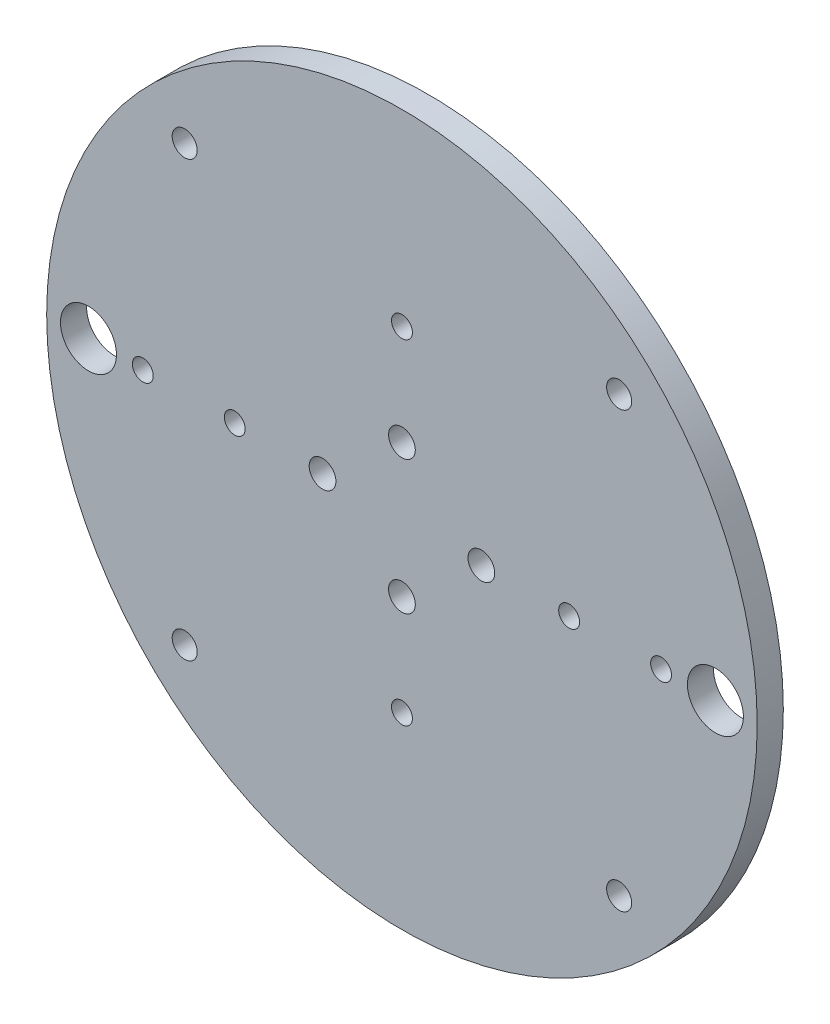
ISO-10303-21;
HEADER;
FILE_DESCRIPTION(('STEP AP214'),'2;1');
FILE_NAME('part.step','',(''),(''),'','','');
FILE_SCHEMA(('AUTOMOTIVE_DESIGN { 1 0 10303 214 1 1 1 1 }'));
ENDSEC;
DATA;
#1=APPLICATION_CONTEXT('core data for automotive mechanical design processes');
#2=APPLICATION_PROTOCOL_DEFINITION('international standard','automotive_design',2000,#1);
#3=PRODUCT_CONTEXT('',#1,'mechanical');
#4=PRODUCT('Part','Part','',(#3));
#5=PRODUCT_RELATED_PRODUCT_CATEGORY('part','',(#4));
#6=PRODUCT_DEFINITION_FORMATION('','',#4);
#7=PRODUCT_DEFINITION_CONTEXT('part definition',#1,'design');
#8=PRODUCT_DEFINITION('design','',#6,#7);
#9=PRODUCT_DEFINITION_SHAPE('','',#8);
#10=(LENGTH_UNIT() NAMED_UNIT(*) SI_UNIT(.MILLI.,.METRE.));
#11=(NAMED_UNIT(*) PLANE_ANGLE_UNIT() SI_UNIT($,.RADIAN.));
#12=(NAMED_UNIT(*) SI_UNIT($,.STERADIAN.) SOLID_ANGLE_UNIT());
#13=UNCERTAINTY_MEASURE_WITH_UNIT(LENGTH_MEASURE(1.E-05),#10,'distance_accuracy_value','');
#14=(GEOMETRIC_REPRESENTATION_CONTEXT(3) GLOBAL_UNCERTAINTY_ASSIGNED_CONTEXT((#13)) GLOBAL_UNIT_ASSIGNED_CONTEXT((#10,
#11,#12)) REPRESENTATION_CONTEXT('',''));
#15=CARTESIAN_POINT('',(0.,0.,0.));
#16=DIRECTION('',(0.,0.,1.));
#17=DIRECTION('',(1.,0.,0.));
#18=AXIS2_PLACEMENT_3D('',#15,#16,#17);
#19=CARTESIAN_POINT('',(0.,0.,3.125));
#20=DIRECTION('',(0.,0.,-1.));
#21=DIRECTION('',(-1.,0.,0.));
#22=AXIS2_PLACEMENT_3D('',#19,#20,#21);
#23=CYLINDRICAL_SURFACE('',#22,42.5);
#24=CARTESIAN_POINT('',(0.,0.,3.125));
#25=DIRECTION('',(0.,0.,1.));
#26=DIRECTION('',(1.,0.,0.));
#27=AXIS2_PLACEMENT_3D('',#24,#25,#26);
#28=CIRCLE('',#27,42.5);
#29=CARTESIAN_POINT('',(42.5,0.,3.125));
#30=VERTEX_POINT('',#29);
#31=EDGE_CURVE('E10',#30,#30,#28,.T.);
#32=ORIENTED_EDGE('',*,*,#31,.F.);
#33=EDGE_LOOP('',(#32));
#34=FACE_BOUND('',#33,.T.);
#35=CARTESIAN_POINT('',(0.,0.,0.));
#36=DIRECTION('',(0.,0.,1.));
#37=DIRECTION('',(1.,0.,0.));
#38=AXIS2_PLACEMENT_3D('',#35,#36,#37);
#39=CIRCLE('',#38,42.5);
#40=CARTESIAN_POINT('',(42.5,0.,0.));
#41=VERTEX_POINT('',#40);
#42=EDGE_CURVE('E40',#41,#41,#39,.T.);
#43=ORIENTED_EDGE('',*,*,#42,.T.);
#44=EDGE_LOOP('',(#43));
#45=FACE_BOUND('',#44,.T.);
#46=ADVANCED_FACE('F37',(#34,#45),#23,.T.);
#47=CARTESIAN_POINT('',(0.,0.,3.125));
#48=DIRECTION('',(0.,0.,1.));
#49=DIRECTION('',(1.,0.,0.));
#50=AXIS2_PLACEMENT_3D('',#47,#48,#49);
#51=PLANE('',#50);
#52=CARTESIAN_POINT('',(-37.4999999999997,1.84410575373168E-13,3.125));
#53=DIRECTION('',(0.,0.,-1.));
#54=DIRECTION('',(-1.,0.,0.));
#55=AXIS2_PLACEMENT_3D('',#52,#53,#54);
#56=CIRCLE('',#55,3.35000000000024);
#57=CARTESIAN_POINT('',(-40.85,1.84410575373168E-13,3.125));
#58=VERTEX_POINT('',#57);
#59=EDGE_CURVE('E101',#58,#58,#56,.T.);
#60=ORIENTED_EDGE('',*,*,#59,.T.);
#61=EDGE_LOOP('',(#60));
#62=FACE_BOUND('',#61,.T.);
#63=CARTESIAN_POINT('',(37.5000000000003,1.9153491814533E-13,3.125));
#64=DIRECTION('',(0.,0.,-1.));
#65=DIRECTION('',(-1.,0.,0.));
#66=AXIS2_PLACEMENT_3D('',#63,#64,#65);
#67=CIRCLE('',#66,3.35000000000026);
#68=CARTESIAN_POINT('',(34.15,1.9153491814533E-13,3.125));
#69=VERTEX_POINT('',#68);
#70=EDGE_CURVE('E133',#69,#69,#67,.T.);
#71=ORIENTED_EDGE('',*,*,#70,.T.);
#72=EDGE_LOOP('',(#71));
#73=FACE_BOUND('',#72,.T.);
#74=CARTESIAN_POINT('',(31.0000000000003,1.9153491814533E-13,3.125));
#75=DIRECTION('',(0.,0.,-1.));
#76=DIRECTION('',(-1.,0.,0.));
#77=AXIS2_PLACEMENT_3D('',#74,#75,#76);
#78=CIRCLE('',#77,1.25000000000026);
#79=CARTESIAN_POINT('',(29.75,1.9153491814533E-13,3.125));
#80=VERTEX_POINT('',#79);
#81=EDGE_CURVE('E127',#80,#80,#78,.T.);
#82=ORIENTED_EDGE('',*,*,#81,.T.);
#83=EDGE_LOOP('',(#82));
#84=FACE_BOUND('',#83,.T.);
#85=CARTESIAN_POINT('',(-30.9999999999997,1.84500780993918E-13,3.125));
#86=DIRECTION('',(0.,0.,-1.));
#87=DIRECTION('',(-1.,0.,0.));
#88=AXIS2_PLACEMENT_3D('',#85,#86,#87);
#89=CIRCLE('',#88,1.25000000000024);
#90=CARTESIAN_POINT('',(-32.25,1.84500780993918E-13,3.125));
#91=VERTEX_POINT('',#90);
#92=EDGE_CURVE('E121',#91,#91,#89,.T.);
#93=ORIENTED_EDGE('',*,*,#92,.T.);
#94=EDGE_LOOP('',(#93));
#95=FACE_BOUND('',#94,.T.);
#96=CARTESIAN_POINT('',(-9.5,0.,3.125));
#97=DIRECTION('',(0.,0.,1.));
#98=DIRECTION('',(1.,0.,0.));
#99=AXIS2_PLACEMENT_3D('',#96,#97,#98);
#100=CIRCLE('',#99,1.6);
#101=CARTESIAN_POINT('',(-7.9,0.,3.125));
#102=VERTEX_POINT('',#101);
#103=EDGE_CURVE('E116',#102,#102,#100,.T.);
#104=ORIENTED_EDGE('',*,*,#103,.F.);
#105=EDGE_LOOP('',(#104));
#106=FACE_BOUND('',#105,.T.);
#107=CARTESIAN_POINT('',(0.,8.,3.125));
#108=DIRECTION('',(0.,0.,1.));
#109=DIRECTION('',(1.,0.,0.));
#110=AXIS2_PLACEMENT_3D('',#107,#108,#109);
#111=CIRCLE('',#110,1.6);
#112=CARTESIAN_POINT('',(1.6,8.,3.125));
#113=VERTEX_POINT('',#112);
#114=EDGE_CURVE('E113',#113,#113,#111,.T.);
#115=ORIENTED_EDGE('',*,*,#114,.F.);
#116=EDGE_LOOP('',(#115));
#117=FACE_BOUND('',#116,.T.);
#118=CARTESIAN_POINT('',(9.5,0.,3.125));
#119=DIRECTION('',(0.,0.,1.));
#120=DIRECTION('',(1.,0.,0.));
#121=AXIS2_PLACEMENT_3D('',#118,#119,#120);
#122=CIRCLE('',#121,1.6);
#123=CARTESIAN_POINT('',(11.1,0.,3.125));
#124=VERTEX_POINT('',#123);
#125=EDGE_CURVE('E107',#124,#124,#122,.T.);
#126=ORIENTED_EDGE('',*,*,#125,.F.);
#127=EDGE_LOOP('',(#126));
#128=FACE_BOUND('',#127,.T.);
#129=CARTESIAN_POINT('',(0.,-8.00000000000001,3.125));
#130=DIRECTION('',(0.,0.,1.));
#131=DIRECTION('',(1.,0.,0.));
#132=AXIS2_PLACEMENT_3D('',#129,#130,#131);
#133=CIRCLE('',#132,1.6);
#134=CARTESIAN_POINT('',(1.6,-8.00000000000001,3.125));
#135=VERTEX_POINT('',#134);
#136=EDGE_CURVE('E100',#135,#135,#133,.T.);
#137=ORIENTED_EDGE('',*,*,#136,.F.);
#138=EDGE_LOOP('',(#137));
#139=FACE_BOUND('',#138,.T.);
#140=CARTESIAN_POINT('',(0.,20.,3.125));
#141=DIRECTION('',(0.,0.,1.));
#142=DIRECTION('',(1.,0.,0.));
#143=AXIS2_PLACEMENT_3D('',#140,#141,#142);
#144=CIRCLE('',#143,1.25);
#145=CARTESIAN_POINT('',(1.25,20.,3.125));
#146=VERTEX_POINT('',#145);
#147=EDGE_CURVE('E92',#146,#146,#144,.T.);
#148=ORIENTED_EDGE('',*,*,#147,.F.);
#149=EDGE_LOOP('',(#148));
#150=FACE_BOUND('',#149,.T.);
#151=CARTESIAN_POINT('',(20.,0.,3.125));
#152=DIRECTION('',(0.,0.,1.));
#153=DIRECTION('',(1.,0.,0.));
#154=AXIS2_PLACEMENT_3D('',#151,#152,#153);
#155=CIRCLE('',#154,1.25);
#156=CARTESIAN_POINT('',(21.25,0.,3.125));
#157=VERTEX_POINT('',#156);
#158=EDGE_CURVE('E89',#157,#157,#155,.T.);
#159=ORIENTED_EDGE('',*,*,#158,.F.);
#160=EDGE_LOOP('',(#159));
#161=FACE_BOUND('',#160,.T.);
#162=CARTESIAN_POINT('',(0.,-20.,3.125));
#163=DIRECTION('',(0.,0.,1.));
#164=DIRECTION('',(1.,0.,0.));
#165=AXIS2_PLACEMENT_3D('',#162,#163,#164);
#166=CIRCLE('',#165,1.25);
#167=CARTESIAN_POINT('',(1.25,-20.,3.125));
#168=VERTEX_POINT('',#167);
#169=EDGE_CURVE('E83',#168,#168,#166,.T.);
#170=ORIENTED_EDGE('',*,*,#169,.F.);
#171=EDGE_LOOP('',(#170));
#172=FACE_BOUND('',#171,.T.);
#173=CARTESIAN_POINT('',(-20.,0.,3.125));
#174=DIRECTION('',(0.,0.,1.));
#175=DIRECTION('',(1.,0.,0.));
#176=AXIS2_PLACEMENT_3D('',#173,#174,#175);
#177=CIRCLE('',#176,1.25);
#178=CARTESIAN_POINT('',(-18.75,0.,3.125));
#179=VERTEX_POINT('',#178);
#180=EDGE_CURVE('E76',#179,#179,#177,.T.);
#181=ORIENTED_EDGE('',*,*,#180,.F.);
#182=EDGE_LOOP('',(#181));
#183=FACE_BOUND('',#182,.T.);
#184=CARTESIAN_POINT('',(25.9861742086056,-25.9861742086057,3.125));
#185=DIRECTION('',(0.,0.,-1.));
#186=DIRECTION('',(-1.,0.,0.));
#187=AXIS2_PLACEMENT_3D('',#184,#185,#186);
#188=CIRCLE('',#187,1.5);
#189=CARTESIAN_POINT('',(24.4861742086056,-25.9861742086057,3.125));
#190=VERTEX_POINT('',#189);
#191=EDGE_CURVE('E62',#190,#190,#188,.T.);
#192=ORIENTED_EDGE('',*,*,#191,.T.);
#193=EDGE_LOOP('',(#192));
#194=FACE_BOUND('',#193,.T.);
#195=CARTESIAN_POINT('',(-25.9861742086055,25.9861742086057,3.125));
#196=DIRECTION('',(0.,0.,-1.));
#197=DIRECTION('',(-1.,0.,0.));
#198=AXIS2_PLACEMENT_3D('',#195,#196,#197);
#199=CIRCLE('',#198,1.5);
#200=CARTESIAN_POINT('',(-27.4861742086055,25.9861742086057,3.125));
#201=VERTEX_POINT('',#200);
#202=EDGE_CURVE('E55',#201,#201,#199,.T.);
#203=ORIENTED_EDGE('',*,*,#202,.T.);
#204=EDGE_LOOP('',(#203));
#205=FACE_BOUND('',#204,.T.);
#206=CARTESIAN_POINT('',(25.9861742086057,25.9861742086056,3.125));
#207=DIRECTION('',(0.,0.,-1.));
#208=DIRECTION('',(-1.,0.,0.));
#209=AXIS2_PLACEMENT_3D('',#206,#207,#208);
#210=CIRCLE('',#209,1.5);
#211=CARTESIAN_POINT('',(24.4861742086057,25.9861742086056,3.125));
#212=VERTEX_POINT('',#211);
#213=EDGE_CURVE('E67',#212,#212,#210,.T.);
#214=ORIENTED_EDGE('',*,*,#213,.T.);
#215=EDGE_LOOP('',(#214));
#216=FACE_BOUND('',#215,.T.);
#217=CARTESIAN_POINT('',(-25.9861742086056,-25.9861742086056,3.125));
#218=DIRECTION('',(0.,0.,-1.));
#219=DIRECTION('',(-1.,0.,0.));
#220=AXIS2_PLACEMENT_3D('',#217,#218,#219);
#221=CIRCLE('',#220,1.5);
#222=CARTESIAN_POINT('',(-27.4861742086056,-25.9861742086056,3.125));
#223=VERTEX_POINT('',#222);
#224=EDGE_CURVE('E47',#223,#223,#221,.T.);
#225=ORIENTED_EDGE('',*,*,#224,.T.);
#226=EDGE_LOOP('',(#225));
#227=FACE_BOUND('',#226,.T.);
#228=ORIENTED_EDGE('',*,*,#31,.T.);
#229=EDGE_LOOP('',(#228));
#230=FACE_BOUND('',#229,.T.);
#231=ADVANCED_FACE('F145',(#62,#73,#84,#95,#106,#117,#128,#139,#150,#161,#172,#183,#194,#205,
#216,#227,#230),#51,.T.);
#232=CARTESIAN_POINT('',(0.,0.,0.));
#233=DIRECTION('',(0.,0.,1.));
#234=DIRECTION('',(1.,0.,0.));
#235=AXIS2_PLACEMENT_3D('',#232,#233,#234);
#236=PLANE('',#235);
#237=CARTESIAN_POINT('',(-37.4999999999997,1.84410575373168E-13,0.));
#238=DIRECTION('',(0.,0.,-1.));
#239=DIRECTION('',(-1.,0.,0.));
#240=AXIS2_PLACEMENT_3D('',#237,#238,#239);
#241=CIRCLE('',#240,3.35000000000024);
#242=CARTESIAN_POINT('',(-40.85,1.84410575373168E-13,0.));
#243=VERTEX_POINT('',#242);
#244=EDGE_CURVE('E139',#243,#243,#241,.T.);
#245=ORIENTED_EDGE('',*,*,#244,.F.);
#246=EDGE_LOOP('',(#245));
#247=FACE_BOUND('',#246,.T.);
#248=CARTESIAN_POINT('',(37.5000000000003,1.9153491814533E-13,0.));
#249=DIRECTION('',(0.,0.,-1.));
#250=DIRECTION('',(-1.,0.,0.));
#251=AXIS2_PLACEMENT_3D('',#248,#249,#250);
#252=CIRCLE('',#251,3.35000000000026);
#253=CARTESIAN_POINT('',(34.15,1.9153491814533E-13,0.));
#254=VERTEX_POINT('',#253);
#255=EDGE_CURVE('E136',#254,#254,#252,.T.);
#256=ORIENTED_EDGE('',*,*,#255,.F.);
#257=EDGE_LOOP('',(#256));
#258=FACE_BOUND('',#257,.T.);
#259=CARTESIAN_POINT('',(31.0000000000003,1.9153491814533E-13,0.));
#260=DIRECTION('',(0.,0.,-1.));
#261=DIRECTION('',(-1.,0.,0.));
#262=AXIS2_PLACEMENT_3D('',#259,#260,#261);
#263=CIRCLE('',#262,1.25000000000026);
#264=CARTESIAN_POINT('',(29.75,1.9153491814533E-13,0.));
#265=VERTEX_POINT('',#264);
#266=EDGE_CURVE('E130',#265,#265,#263,.T.);
#267=ORIENTED_EDGE('',*,*,#266,.F.);
#268=EDGE_LOOP('',(#267));
#269=FACE_BOUND('',#268,.T.);
#270=CARTESIAN_POINT('',(-30.9999999999997,1.84500780993918E-13,0.));
#271=DIRECTION('',(0.,0.,-1.));
#272=DIRECTION('',(-1.,0.,0.));
#273=AXIS2_PLACEMENT_3D('',#270,#271,#272);
#274=CIRCLE('',#273,1.25000000000024);
#275=CARTESIAN_POINT('',(-32.25,1.84500780993918E-13,0.));
#276=VERTEX_POINT('',#275);
#277=EDGE_CURVE('E124',#276,#276,#274,.T.);
#278=ORIENTED_EDGE('',*,*,#277,.F.);
#279=EDGE_LOOP('',(#278));
#280=FACE_BOUND('',#279,.T.);
#281=CARTESIAN_POINT('',(-9.5,0.,0.));
#282=DIRECTION('',(0.,0.,1.));
#283=DIRECTION('',(1.,0.,0.));
#284=AXIS2_PLACEMENT_3D('',#281,#282,#283);
#285=CIRCLE('',#284,1.6);
#286=CARTESIAN_POINT('',(-7.9,0.,0.));
#287=VERTEX_POINT('',#286);
#288=EDGE_CURVE('E77',#287,#287,#285,.T.);
#289=ORIENTED_EDGE('',*,*,#288,.T.);
#290=EDGE_LOOP('',(#289));
#291=FACE_BOUND('',#290,.T.);
#292=CARTESIAN_POINT('',(0.,8.,0.));
#293=DIRECTION('',(0.,0.,1.));
#294=DIRECTION('',(1.,0.,0.));
#295=AXIS2_PLACEMENT_3D('',#292,#293,#294);
#296=CIRCLE('',#295,1.6);
#297=CARTESIAN_POINT('',(1.6,8.,0.));
#298=VERTEX_POINT('',#297);
#299=EDGE_CURVE('E110',#298,#298,#296,.T.);
#300=ORIENTED_EDGE('',*,*,#299,.T.);
#301=EDGE_LOOP('',(#300));
#302=FACE_BOUND('',#301,.T.);
#303=CARTESIAN_POINT('',(9.5,0.,0.));
#304=DIRECTION('',(0.,0.,1.));
#305=DIRECTION('',(1.,0.,0.));
#306=AXIS2_PLACEMENT_3D('',#303,#304,#305);
#307=CIRCLE('',#306,1.6);
#308=CARTESIAN_POINT('',(11.1,0.,0.));
#309=VERTEX_POINT('',#308);
#310=EDGE_CURVE('E104',#309,#309,#307,.T.);
#311=ORIENTED_EDGE('',*,*,#310,.T.);
#312=EDGE_LOOP('',(#311));
#313=FACE_BOUND('',#312,.T.);
#314=CARTESIAN_POINT('',(0.,-8.00000000000001,0.));
#315=DIRECTION('',(0.,0.,1.));
#316=DIRECTION('',(1.,0.,0.));
#317=AXIS2_PLACEMENT_3D('',#314,#315,#316);
#318=CIRCLE('',#317,1.6);
#319=CARTESIAN_POINT('',(1.6,-8.00000000000001,0.));
#320=VERTEX_POINT('',#319);
#321=EDGE_CURVE('E97',#320,#320,#318,.T.);
#322=ORIENTED_EDGE('',*,*,#321,.T.);
#323=EDGE_LOOP('',(#322));
#324=FACE_BOUND('',#323,.T.);
#325=CARTESIAN_POINT('',(0.,20.,0.));
#326=DIRECTION('',(0.,0.,1.));
#327=DIRECTION('',(1.,0.,0.));
#328=AXIS2_PLACEMENT_3D('',#325,#326,#327);
#329=CIRCLE('',#328,1.25);
#330=CARTESIAN_POINT('',(1.25,20.,0.));
#331=VERTEX_POINT('',#330);
#332=EDGE_CURVE('E70',#331,#331,#329,.T.);
#333=ORIENTED_EDGE('',*,*,#332,.T.);
#334=EDGE_LOOP('',(#333));
#335=FACE_BOUND('',#334,.T.);
#336=CARTESIAN_POINT('',(20.,0.,0.));
#337=DIRECTION('',(0.,0.,1.));
#338=DIRECTION('',(1.,0.,0.));
#339=AXIS2_PLACEMENT_3D('',#336,#337,#338);
#340=CIRCLE('',#339,1.25);
#341=CARTESIAN_POINT('',(21.25,0.,0.));
#342=VERTEX_POINT('',#341);
#343=EDGE_CURVE('E86',#342,#342,#340,.T.);
#344=ORIENTED_EDGE('',*,*,#343,.T.);
#345=EDGE_LOOP('',(#344));
#346=FACE_BOUND('',#345,.T.);
#347=CARTESIAN_POINT('',(0.,-20.,0.));
#348=DIRECTION('',(0.,0.,1.));
#349=DIRECTION('',(1.,0.,0.));
#350=AXIS2_PLACEMENT_3D('',#347,#348,#349);
#351=CIRCLE('',#350,1.25);
#352=CARTESIAN_POINT('',(1.25,-20.,0.));
#353=VERTEX_POINT('',#352);
#354=EDGE_CURVE('E80',#353,#353,#351,.T.);
#355=ORIENTED_EDGE('',*,*,#354,.T.);
#356=EDGE_LOOP('',(#355));
#357=FACE_BOUND('',#356,.T.);
#358=CARTESIAN_POINT('',(-20.,0.,0.));
#359=DIRECTION('',(0.,0.,1.));
#360=DIRECTION('',(1.,0.,0.));
#361=AXIS2_PLACEMENT_3D('',#358,#359,#360);
#362=CIRCLE('',#361,1.25);
#363=CARTESIAN_POINT('',(-18.75,0.,0.));
#364=VERTEX_POINT('',#363);
#365=EDGE_CURVE('E73',#364,#364,#362,.T.);
#366=ORIENTED_EDGE('',*,*,#365,.T.);
#367=EDGE_LOOP('',(#366));
#368=FACE_BOUND('',#367,.T.);
#369=CARTESIAN_POINT('',(25.9861742086056,-25.9861742086057,0.));
#370=DIRECTION('',(0.,0.,-1.));
#371=DIRECTION('',(-1.,0.,0.));
#372=AXIS2_PLACEMENT_3D('',#369,#370,#371);
#373=CIRCLE('',#372,1.5);
#374=CARTESIAN_POINT('',(24.4861742086056,-25.9861742086057,0.));
#375=VERTEX_POINT('',#374);
#376=EDGE_CURVE('E52',#375,#375,#373,.T.);
#377=ORIENTED_EDGE('',*,*,#376,.F.);
#378=EDGE_LOOP('',(#377));
#379=FACE_BOUND('',#378,.T.);
#380=CARTESIAN_POINT('',(-25.9861742086055,25.9861742086057,0.));
#381=DIRECTION('',(0.,0.,-1.));
#382=DIRECTION('',(-1.,0.,0.));
#383=AXIS2_PLACEMENT_3D('',#380,#381,#382);
#384=CIRCLE('',#383,1.5);
#385=CARTESIAN_POINT('',(-27.4861742086055,25.9861742086057,0.));
#386=VERTEX_POINT('',#385);
#387=EDGE_CURVE('E58',#386,#386,#384,.T.);
#388=ORIENTED_EDGE('',*,*,#387,.F.);
#389=EDGE_LOOP('',(#388));
#390=FACE_BOUND('',#389,.T.);
#391=CARTESIAN_POINT('',(25.9861742086057,25.9861742086056,0.));
#392=DIRECTION('',(0.,0.,-1.));
#393=DIRECTION('',(-1.,0.,0.));
#394=AXIS2_PLACEMENT_3D('',#391,#392,#393);
#395=CIRCLE('',#394,1.5);
#396=CARTESIAN_POINT('',(24.4861742086057,25.9861742086056,0.));
#397=VERTEX_POINT('',#396);
#398=EDGE_CURVE('E59',#397,#397,#395,.T.);
#399=ORIENTED_EDGE('',*,*,#398,.F.);
#400=EDGE_LOOP('',(#399));
#401=FACE_BOUND('',#400,.T.);
#402=CARTESIAN_POINT('',(-25.9861742086056,-25.9861742086056,0.));
#403=DIRECTION('',(0.,0.,-1.));
#404=DIRECTION('',(-1.,0.,0.));
#405=AXIS2_PLACEMENT_3D('',#402,#403,#404);
#406=CIRCLE('',#405,1.5);
#407=CARTESIAN_POINT('',(-27.4861742086056,-25.9861742086056,0.));
#408=VERTEX_POINT('',#407);
#409=EDGE_CURVE('E49',#408,#408,#406,.T.);
#410=ORIENTED_EDGE('',*,*,#409,.F.);
#411=EDGE_LOOP('',(#410));
#412=FACE_BOUND('',#411,.T.);
#413=ORIENTED_EDGE('',*,*,#42,.F.);
#414=EDGE_LOOP('',(#413));
#415=FACE_BOUND('',#414,.T.);
#416=ADVANCED_FACE('F155',(#247,#258,#269,#280,#291,#302,#313,#324,#335,#346,#357,#368,#379,
#390,#401,#412,#415),#236,.F.);
#417=CARTESIAN_POINT('',(-25.9861742086056,-25.9861742086056,3.125));
#418=DIRECTION('',(0.,0.,-1.));
#419=DIRECTION('',(-1.,0.,0.));
#420=AXIS2_PLACEMENT_3D('',#417,#418,#419);
#421=CYLINDRICAL_SURFACE('',#420,1.5);
#422=ORIENTED_EDGE('',*,*,#224,.F.);
#423=EDGE_LOOP('',(#422));
#424=FACE_BOUND('',#423,.T.);
#425=ORIENTED_EDGE('',*,*,#409,.T.);
#426=EDGE_LOOP('',(#425));
#427=FACE_BOUND('',#426,.T.);
#428=ADVANCED_FACE('F158',(#424,#427),#421,.F.);
#429=CARTESIAN_POINT('',(25.9861742086057,25.9861742086056,3.125));
#430=DIRECTION('',(0.,0.,-1.));
#431=DIRECTION('',(-1.,0.,0.));
#432=AXIS2_PLACEMENT_3D('',#429,#430,#431);
#433=CYLINDRICAL_SURFACE('',#432,1.5);
#434=ORIENTED_EDGE('',*,*,#213,.F.);
#435=EDGE_LOOP('',(#434));
#436=FACE_BOUND('',#435,.T.);
#437=ORIENTED_EDGE('',*,*,#398,.T.);
#438=EDGE_LOOP('',(#437));
#439=FACE_BOUND('',#438,.T.);
#440=ADVANCED_FACE('F203',(#436,#439),#433,.F.);
#441=CARTESIAN_POINT('',(-25.9861742086055,25.9861742086057,3.125));
#442=DIRECTION('',(0.,0.,-1.));
#443=DIRECTION('',(-1.,0.,0.));
#444=AXIS2_PLACEMENT_3D('',#441,#442,#443);
#445=CYLINDRICAL_SURFACE('',#444,1.5);
#446=ORIENTED_EDGE('',*,*,#202,.F.);
#447=EDGE_LOOP('',(#446));
#448=FACE_BOUND('',#447,.T.);
#449=ORIENTED_EDGE('',*,*,#387,.T.);
#450=EDGE_LOOP('',(#449));
#451=FACE_BOUND('',#450,.T.);
#452=ADVANCED_FACE('F205',(#448,#451),#445,.F.);
#453=CARTESIAN_POINT('',(25.9861742086056,-25.9861742086057,3.125));
#454=DIRECTION('',(0.,0.,-1.));
#455=DIRECTION('',(-1.,0.,0.));
#456=AXIS2_PLACEMENT_3D('',#453,#454,#455);
#457=CYLINDRICAL_SURFACE('',#456,1.5);
#458=ORIENTED_EDGE('',*,*,#191,.F.);
#459=EDGE_LOOP('',(#458));
#460=FACE_BOUND('',#459,.T.);
#461=ORIENTED_EDGE('',*,*,#376,.T.);
#462=EDGE_LOOP('',(#461));
#463=FACE_BOUND('',#462,.T.);
#464=ADVANCED_FACE('F208',(#460,#463),#457,.F.);
#465=CARTESIAN_POINT('',(-20.,0.,0.));
#466=DIRECTION('',(0.,0.,1.));
#467=DIRECTION('',(1.,0.,0.));
#468=AXIS2_PLACEMENT_3D('',#465,#466,#467);
#469=CYLINDRICAL_SURFACE('',#468,1.25);
#470=ORIENTED_EDGE('',*,*,#365,.F.);
#471=EDGE_LOOP('',(#470));
#472=FACE_BOUND('',#471,.T.);
#473=ORIENTED_EDGE('',*,*,#180,.T.);
#474=EDGE_LOOP('',(#473));
#475=FACE_BOUND('',#474,.T.);
#476=ADVANCED_FACE('F212',(#472,#475),#469,.F.);
#477=CARTESIAN_POINT('',(0.,-20.,0.));
#478=DIRECTION('',(0.,0.,1.));
#479=DIRECTION('',(1.,0.,0.));
#480=AXIS2_PLACEMENT_3D('',#477,#478,#479);
#481=CYLINDRICAL_SURFACE('',#480,1.25);
#482=ORIENTED_EDGE('',*,*,#354,.F.);
#483=EDGE_LOOP('',(#482));
#484=FACE_BOUND('',#483,.T.);
#485=ORIENTED_EDGE('',*,*,#169,.T.);
#486=EDGE_LOOP('',(#485));
#487=FACE_BOUND('',#486,.T.);
#488=ADVANCED_FACE('F219',(#484,#487),#481,.F.);
#489=CARTESIAN_POINT('',(20.,0.,0.));
#490=DIRECTION('',(0.,0.,1.));
#491=DIRECTION('',(1.,0.,0.));
#492=AXIS2_PLACEMENT_3D('',#489,#490,#491);
#493=CYLINDRICAL_SURFACE('',#492,1.25);
#494=ORIENTED_EDGE('',*,*,#343,.F.);
#495=EDGE_LOOP('',(#494));
#496=FACE_BOUND('',#495,.T.);
#497=ORIENTED_EDGE('',*,*,#158,.T.);
#498=EDGE_LOOP('',(#497));
#499=FACE_BOUND('',#498,.T.);
#500=ADVANCED_FACE('F223',(#496,#499),#493,.F.);
#501=CARTESIAN_POINT('',(0.,20.,0.));
#502=DIRECTION('',(0.,0.,1.));
#503=DIRECTION('',(1.,0.,0.));
#504=AXIS2_PLACEMENT_3D('',#501,#502,#503);
#505=CYLINDRICAL_SURFACE('',#504,1.25);
#506=ORIENTED_EDGE('',*,*,#332,.F.);
#507=EDGE_LOOP('',(#506));
#508=FACE_BOUND('',#507,.T.);
#509=ORIENTED_EDGE('',*,*,#147,.T.);
#510=EDGE_LOOP('',(#509));
#511=FACE_BOUND('',#510,.T.);
#512=ADVANCED_FACE('F227',(#508,#511),#505,.F.);
#513=CARTESIAN_POINT('',(0.,-8.00000000000001,0.));
#514=DIRECTION('',(0.,0.,1.));
#515=DIRECTION('',(1.,0.,0.));
#516=AXIS2_PLACEMENT_3D('',#513,#514,#515);
#517=CYLINDRICAL_SURFACE('',#516,1.6);
#518=ORIENTED_EDGE('',*,*,#321,.F.);
#519=EDGE_LOOP('',(#518));
#520=FACE_BOUND('',#519,.T.);
#521=ORIENTED_EDGE('',*,*,#136,.T.);
#522=EDGE_LOOP('',(#521));
#523=FACE_BOUND('',#522,.T.);
#524=ADVANCED_FACE('F231',(#520,#523),#517,.F.);
#525=CARTESIAN_POINT('',(9.5,0.,0.));
#526=DIRECTION('',(0.,0.,1.));
#527=DIRECTION('',(1.,0.,0.));
#528=AXIS2_PLACEMENT_3D('',#525,#526,#527);
#529=CYLINDRICAL_SURFACE('',#528,1.6);
#530=ORIENTED_EDGE('',*,*,#310,.F.);
#531=EDGE_LOOP('',(#530));
#532=FACE_BOUND('',#531,.T.);
#533=ORIENTED_EDGE('',*,*,#125,.T.);
#534=EDGE_LOOP('',(#533));
#535=FACE_BOUND('',#534,.T.);
#536=ADVANCED_FACE('F235',(#532,#535),#529,.F.);
#537=CARTESIAN_POINT('',(0.,8.,0.));
#538=DIRECTION('',(0.,0.,1.));
#539=DIRECTION('',(1.,0.,0.));
#540=AXIS2_PLACEMENT_3D('',#537,#538,#539);
#541=CYLINDRICAL_SURFACE('',#540,1.6);
#542=ORIENTED_EDGE('',*,*,#299,.F.);
#543=EDGE_LOOP('',(#542));
#544=FACE_BOUND('',#543,.T.);
#545=ORIENTED_EDGE('',*,*,#114,.T.);
#546=EDGE_LOOP('',(#545));
#547=FACE_BOUND('',#546,.T.);
#548=ADVANCED_FACE('F239',(#544,#547),#541,.F.);
#549=CARTESIAN_POINT('',(-9.5,0.,0.));
#550=DIRECTION('',(0.,0.,1.));
#551=DIRECTION('',(1.,0.,0.));
#552=AXIS2_PLACEMENT_3D('',#549,#550,#551);
#553=CYLINDRICAL_SURFACE('',#552,1.6);
#554=ORIENTED_EDGE('',*,*,#288,.F.);
#555=EDGE_LOOP('',(#554));
#556=FACE_BOUND('',#555,.T.);
#557=ORIENTED_EDGE('',*,*,#103,.T.);
#558=EDGE_LOOP('',(#557));
#559=FACE_BOUND('',#558,.T.);
#560=ADVANCED_FACE('F243',(#556,#559),#553,.F.);
#561=CARTESIAN_POINT('',(-30.9999999999997,1.84500780993918E-13,3.125));
#562=DIRECTION('',(0.,0.,-1.));
#563=DIRECTION('',(-1.,0.,0.));
#564=AXIS2_PLACEMENT_3D('',#561,#562,#563);
#565=CYLINDRICAL_SURFACE('',#564,1.25000000000024);
#566=ORIENTED_EDGE('',*,*,#92,.F.);
#567=EDGE_LOOP('',(#566));
#568=FACE_BOUND('',#567,.T.);
#569=ORIENTED_EDGE('',*,*,#277,.T.);
#570=EDGE_LOOP('',(#569));
#571=FACE_BOUND('',#570,.T.);
#572=ADVANCED_FACE('F246',(#568,#571),#565,.F.);
#573=CARTESIAN_POINT('',(31.0000000000003,1.9153491814533E-13,3.125));
#574=DIRECTION('',(0.,0.,-1.));
#575=DIRECTION('',(-1.,0.,0.));
#576=AXIS2_PLACEMENT_3D('',#573,#574,#575);
#577=CYLINDRICAL_SURFACE('',#576,1.25000000000026);
#578=ORIENTED_EDGE('',*,*,#81,.F.);
#579=EDGE_LOOP('',(#578));
#580=FACE_BOUND('',#579,.T.);
#581=ORIENTED_EDGE('',*,*,#266,.T.);
#582=EDGE_LOOP('',(#581));
#583=FACE_BOUND('',#582,.T.);
#584=ADVANCED_FACE('F250',(#580,#583),#577,.F.);
#585=CARTESIAN_POINT('',(37.5000000000003,1.9153491814533E-13,3.125));
#586=DIRECTION('',(0.,0.,-1.));
#587=DIRECTION('',(-1.,0.,0.));
#588=AXIS2_PLACEMENT_3D('',#585,#586,#587);
#589=CYLINDRICAL_SURFACE('',#588,3.35000000000026);
#590=ORIENTED_EDGE('',*,*,#70,.F.);
#591=EDGE_LOOP('',(#590));
#592=FACE_BOUND('',#591,.T.);
#593=ORIENTED_EDGE('',*,*,#255,.T.);
#594=EDGE_LOOP('',(#593));
#595=FACE_BOUND('',#594,.T.);
#596=ADVANCED_FACE('F151',(#592,#595),#589,.F.);
#597=CARTESIAN_POINT('',(-37.4999999999997,1.84410575373168E-13,3.125));
#598=DIRECTION('',(0.,0.,-1.));
#599=DIRECTION('',(-1.,0.,0.));
#600=AXIS2_PLACEMENT_3D('',#597,#598,#599);
#601=CYLINDRICAL_SURFACE('',#600,3.35000000000024);
#602=ORIENTED_EDGE('',*,*,#59,.F.);
#603=EDGE_LOOP('',(#602));
#604=FACE_BOUND('',#603,.T.);
#605=ORIENTED_EDGE('',*,*,#244,.T.);
#606=EDGE_LOOP('',(#605));
#607=FACE_BOUND('',#606,.T.);
#608=ADVANCED_FACE('F148',(#604,#607),#601,.F.);
#609=CLOSED_SHELL('',(#46,#231,#416,#428,#440,#452,#464,#476,#488,#500,#512,#524,#536,#548,#560,
#572,#584,#596,#608));
#610=MANIFOLD_SOLID_BREP('B2',#609);
#611=ADVANCED_BREP_SHAPE_REPRESENTATION('',(#18,#610),#14);
#612=SHAPE_DEFINITION_REPRESENTATION(#9,#611);
ENDSEC;
END-ISO-10303-21;
